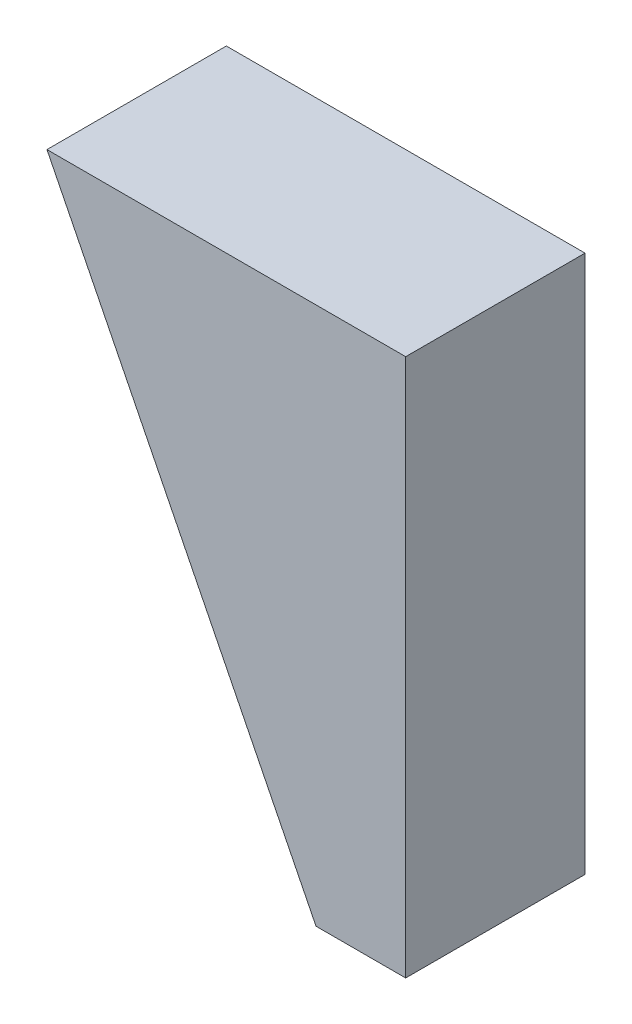
ISO-10303-21;
HEADER;
FILE_DESCRIPTION(('STEP AP214'),'2;1');
FILE_NAME('part.step','',(''),(''),'','','');
FILE_SCHEMA(('AUTOMOTIVE_DESIGN { 1 0 10303 214 1 1 1 1 }'));
ENDSEC;
DATA;
#1=APPLICATION_CONTEXT('core data for automotive mechanical design processes');
#2=APPLICATION_PROTOCOL_DEFINITION('international standard','automotive_design',2000,#1);
#3=PRODUCT_CONTEXT('',#1,'mechanical');
#4=PRODUCT('Part','Part','',(#3));
#5=PRODUCT_RELATED_PRODUCT_CATEGORY('part','',(#4));
#6=PRODUCT_DEFINITION_FORMATION('','',#4);
#7=PRODUCT_DEFINITION_CONTEXT('part definition',#1,'design');
#8=PRODUCT_DEFINITION('design','',#6,#7);
#9=PRODUCT_DEFINITION_SHAPE('','',#8);
#10=(LENGTH_UNIT() NAMED_UNIT(*) SI_UNIT(.MILLI.,.METRE.));
#11=(NAMED_UNIT(*) PLANE_ANGLE_UNIT() SI_UNIT($,.RADIAN.));
#12=(NAMED_UNIT(*) SI_UNIT($,.STERADIAN.) SOLID_ANGLE_UNIT());
#13=UNCERTAINTY_MEASURE_WITH_UNIT(LENGTH_MEASURE(1.E-05),#10,'distance_accuracy_value','');
#14=(GEOMETRIC_REPRESENTATION_CONTEXT(3) GLOBAL_UNCERTAINTY_ASSIGNED_CONTEXT((#13)) GLOBAL_UNIT_ASSIGNED_CONTEXT((#10,
#11,#12)) REPRESENTATION_CONTEXT('',''));
#15=CARTESIAN_POINT('',(0.,0.,0.));
#16=DIRECTION('',(0.,0.,1.));
#17=DIRECTION('',(1.,0.,0.));
#18=AXIS2_PLACEMENT_3D('',#15,#16,#17);
#19=CARTESIAN_POINT('',(1239.64999999998,19.0500000000036,50.8));
#20=DIRECTION('',(0.,-1.,0.));
#21=DIRECTION('',(0.,0.,-1.));
#22=AXIS2_PLACEMENT_3D('',#19,#20,#21);
#23=PLANE('',#22);
#24=DIRECTION('',(-1.,0.,0.));
#25=VECTOR('',#24,1.);
#26=CARTESIAN_POINT('',(1239.64999999998,19.0500000000036,0.));
#27=LINE('',#26,#25);
#28=CARTESIAN_POINT('',(1341.24999999998,19.0500000000036,0.));
#29=VERTEX_POINT('',#28);
#30=CARTESIAN_POINT('',(1239.64999999998,19.0500000000036,0.));
#31=VERTEX_POINT('',#30);
#32=EDGE_CURVE('E96',#29,#31,#27,.T.);
#33=ORIENTED_EDGE('',*,*,#32,.T.);
#34=DIRECTION('',(0.,0.,-1.));
#35=VECTOR('',#34,1.);
#36=CARTESIAN_POINT('',(1239.64999999998,19.0500000000036,50.8));
#37=LINE('',#36,#35);
#38=CARTESIAN_POINT('',(1239.64999999998,19.0500000000036,50.8));
#39=VERTEX_POINT('',#38);
#40=EDGE_CURVE('E11',#39,#31,#37,.T.);
#41=ORIENTED_EDGE('',*,*,#40,.F.);
#42=DIRECTION('',(-1.,0.,0.));
#43=VECTOR('',#42,1.);
#44=CARTESIAN_POINT('',(1239.64999999998,19.0500000000036,50.8));
#45=LINE('',#44,#43);
#46=CARTESIAN_POINT('',(1341.24999999998,19.0500000000036,50.8));
#47=VERTEX_POINT('',#46);
#48=EDGE_CURVE('E84',#47,#39,#45,.T.);
#49=ORIENTED_EDGE('',*,*,#48,.F.);
#50=DIRECTION('',(0.,0.,-1.));
#51=VECTOR('',#50,1.);
#52=CARTESIAN_POINT('',(1341.24999999998,19.0500000000036,50.8));
#53=LINE('',#52,#51);
#54=EDGE_CURVE('E92',#47,#29,#53,.T.);
#55=ORIENTED_EDGE('',*,*,#54,.T.);
#56=EDGE_LOOP('',(#33,#41,#49,#55));
#57=FACE_BOUND('',#56,.T.);
#58=ADVANCED_FACE('F33',(#57),#23,.F.);
#59=CARTESIAN_POINT('',(1315.84999999998,-133.349999999996,50.8));
#60=DIRECTION('',(0.894427190999916,0.447213595499957,0.));
#61=DIRECTION('',(-0.447213595499957,0.894427190999916,0.));
#62=AXIS2_PLACEMENT_3D('',#59,#60,#61);
#63=PLANE('',#62);
#64=DIRECTION('',(0.447213595499957,-0.894427190999916,0.));
#65=VECTOR('',#64,1.);
#66=CARTESIAN_POINT('',(1315.84999999998,-133.349999999996,0.));
#67=LINE('',#66,#65);
#68=CARTESIAN_POINT('',(1315.84999999998,-133.349999999996,0.));
#69=VERTEX_POINT('',#68);
#70=EDGE_CURVE('E88',#31,#69,#67,.T.);
#71=ORIENTED_EDGE('',*,*,#70,.T.);
#72=DIRECTION('',(0.,0.,-1.));
#73=VECTOR('',#72,1.);
#74=CARTESIAN_POINT('',(1315.84999999998,-133.349999999996,50.8));
#75=LINE('',#74,#73);
#76=CARTESIAN_POINT('',(1315.84999999998,-133.349999999996,50.8));
#77=VERTEX_POINT('',#76);
#78=EDGE_CURVE('E41',#77,#69,#75,.T.);
#79=ORIENTED_EDGE('',*,*,#78,.F.);
#80=DIRECTION('',(0.447213595499957,-0.894427190999916,0.));
#81=VECTOR('',#80,1.);
#82=CARTESIAN_POINT('',(1315.84999999998,-133.349999999996,50.8));
#83=LINE('',#82,#81);
#84=EDGE_CURVE('E79',#39,#77,#83,.T.);
#85=ORIENTED_EDGE('',*,*,#84,.F.);
#86=ORIENTED_EDGE('',*,*,#40,.T.);
#87=EDGE_LOOP('',(#71,#79,#85,#86));
#88=FACE_BOUND('',#87,.T.);
#89=ADVANCED_FACE('F87',(#88),#63,.F.);
#90=CARTESIAN_POINT('',(1341.24999999998,-133.349999999996,50.8));
#91=DIRECTION('',(0.,1.,0.));
#92=DIRECTION('',(0.,0.,1.));
#93=AXIS2_PLACEMENT_3D('',#90,#91,#92);
#94=PLANE('',#93);
#95=DIRECTION('',(1.,0.,0.));
#96=VECTOR('',#95,1.);
#97=CARTESIAN_POINT('',(1341.24999999998,-133.349999999996,0.));
#98=LINE('',#97,#96);
#99=CARTESIAN_POINT('',(1341.24999999998,-133.349999999996,0.));
#100=VERTEX_POINT('',#99);
#101=EDGE_CURVE('E66',#69,#100,#98,.T.);
#102=ORIENTED_EDGE('',*,*,#101,.T.);
#103=DIRECTION('',(0.,0.,-1.));
#104=VECTOR('',#103,1.);
#105=CARTESIAN_POINT('',(1341.24999999998,-133.349999999996,50.8));
#106=LINE('',#105,#104);
#107=CARTESIAN_POINT('',(1341.24999999998,-133.349999999996,50.8));
#108=VERTEX_POINT('',#107);
#109=EDGE_CURVE('E89',#108,#100,#106,.T.);
#110=ORIENTED_EDGE('',*,*,#109,.F.);
#111=DIRECTION('',(1.,0.,0.));
#112=VECTOR('',#111,1.);
#113=CARTESIAN_POINT('',(1341.24999999998,-133.349999999996,50.8));
#114=LINE('',#113,#112);
#115=EDGE_CURVE('E82',#77,#108,#114,.T.);
#116=ORIENTED_EDGE('',*,*,#115,.F.);
#117=ORIENTED_EDGE('',*,*,#78,.T.);
#118=EDGE_LOOP('',(#102,#110,#116,#117));
#119=FACE_BOUND('',#118,.T.);
#120=ADVANCED_FACE('F90',(#119),#94,.F.);
#121=CARTESIAN_POINT('',(1341.24999999998,19.0500000000036,50.8));
#122=DIRECTION('',(-1.,0.,0.));
#123=DIRECTION('',(0.,0.,1.));
#124=AXIS2_PLACEMENT_3D('',#121,#122,#123);
#125=PLANE('',#124);
#126=DIRECTION('',(0.,1.,0.));
#127=VECTOR('',#126,1.);
#128=CARTESIAN_POINT('',(1341.24999999998,19.0500000000036,0.));
#129=LINE('',#128,#127);
#130=EDGE_CURVE('E72',#100,#29,#129,.T.);
#131=ORIENTED_EDGE('',*,*,#130,.T.);
#132=ORIENTED_EDGE('',*,*,#54,.F.);
#133=DIRECTION('',(0.,1.,0.));
#134=VECTOR('',#133,1.);
#135=CARTESIAN_POINT('',(1341.24999999998,19.0500000000036,50.8));
#136=LINE('',#135,#134);
#137=EDGE_CURVE('E49',#108,#47,#136,.T.);
#138=ORIENTED_EDGE('',*,*,#137,.F.);
#139=ORIENTED_EDGE('',*,*,#109,.T.);
#140=EDGE_LOOP('',(#131,#132,#138,#139));
#141=FACE_BOUND('',#140,.T.);
#142=ADVANCED_FACE('F103',(#141),#125,.F.);
#143=CARTESIAN_POINT('',(0.,0.,50.8));
#144=DIRECTION('',(0.,0.,-1.));
#145=DIRECTION('',(-1.,0.,0.));
#146=AXIS2_PLACEMENT_3D('',#143,#144,#145);
#147=PLANE('',#146);
#148=ORIENTED_EDGE('',*,*,#48,.T.);
#149=ORIENTED_EDGE('',*,*,#84,.T.);
#150=ORIENTED_EDGE('',*,*,#115,.T.);
#151=ORIENTED_EDGE('',*,*,#137,.T.);
#152=EDGE_LOOP('',(#148,#149,#150,#151));
#153=FACE_BOUND('',#152,.T.);
#154=ADVANCED_FACE('F80',(#153),#147,.F.);
#155=CARTESIAN_POINT('',(0.,0.,0.));
#156=DIRECTION('',(0.,0.,-1.));
#157=DIRECTION('',(-1.,0.,0.));
#158=AXIS2_PLACEMENT_3D('',#155,#156,#157);
#159=PLANE('',#158);
#160=ORIENTED_EDGE('',*,*,#32,.F.);
#161=ORIENTED_EDGE('',*,*,#130,.F.);
#162=ORIENTED_EDGE('',*,*,#101,.F.);
#163=ORIENTED_EDGE('',*,*,#70,.F.);
#164=EDGE_LOOP('',(#160,#161,#162,#163));
#165=FACE_BOUND('',#164,.T.);
#166=ADVANCED_FACE('F106',(#165),#159,.T.);
#167=CLOSED_SHELL('',(#58,#89,#120,#142,#154,#166));
#168=MANIFOLD_SOLID_BREP('B2',#167);
#169=ADVANCED_BREP_SHAPE_REPRESENTATION('',(#18,#168),#14);
#170=SHAPE_DEFINITION_REPRESENTATION(#9,#169);
ENDSEC;
END-ISO-10303-21;
